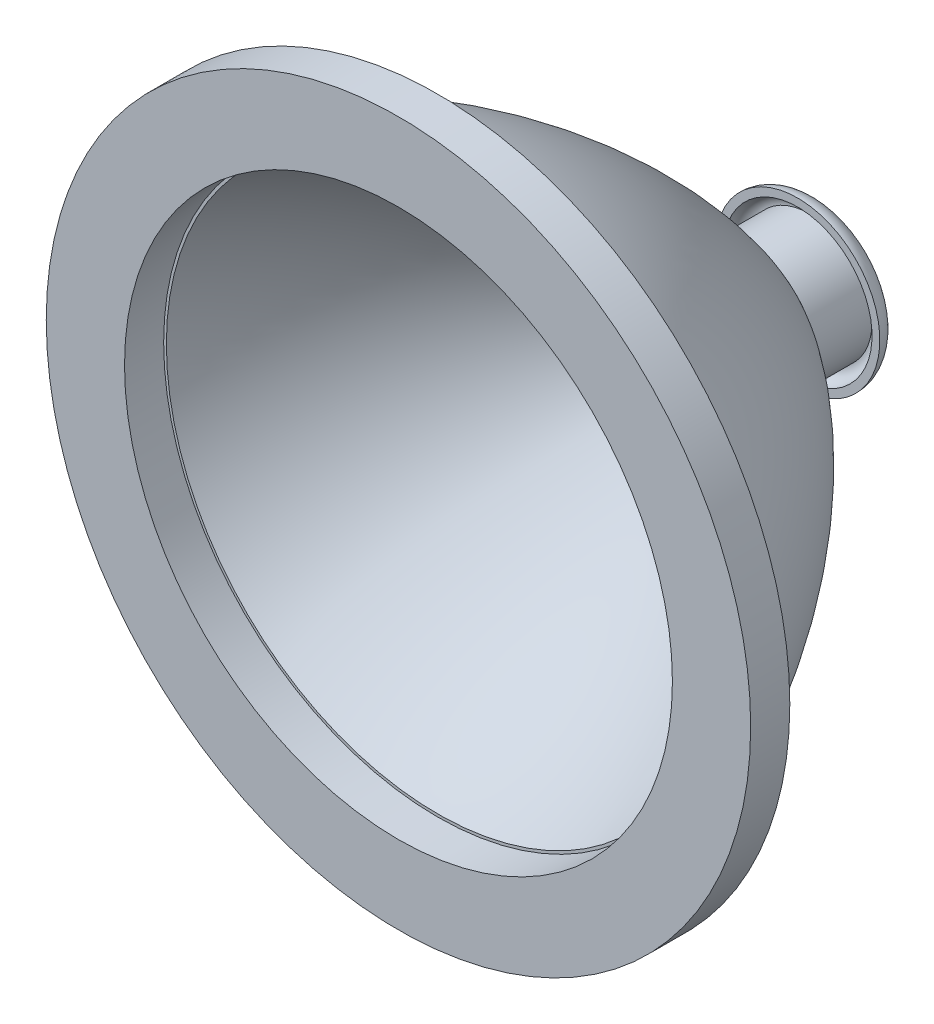
ISO-10303-21;
HEADER;
FILE_DESCRIPTION(('STEP AP214'),'2;1');
FILE_NAME('part.step','',(''),(''),'','','');
FILE_SCHEMA(('AUTOMOTIVE_DESIGN { 1 0 10303 214 1 1 1 1 }'));
ENDSEC;
DATA;
#1=APPLICATION_CONTEXT('core data for automotive mechanical design processes');
#2=APPLICATION_PROTOCOL_DEFINITION('international standard','automotive_design',2000,#1);
#3=PRODUCT_CONTEXT('',#1,'mechanical');
#4=PRODUCT('Part','Part','',(#3));
#5=PRODUCT_RELATED_PRODUCT_CATEGORY('part','',(#4));
#6=PRODUCT_DEFINITION_FORMATION('','',#4);
#7=PRODUCT_DEFINITION_CONTEXT('part definition',#1,'design');
#8=PRODUCT_DEFINITION('design','',#6,#7);
#9=PRODUCT_DEFINITION_SHAPE('','',#8);
#10=(LENGTH_UNIT() NAMED_UNIT(*) SI_UNIT(.MILLI.,.METRE.));
#11=(NAMED_UNIT(*) PLANE_ANGLE_UNIT() SI_UNIT($,.RADIAN.));
#12=(NAMED_UNIT(*) SI_UNIT($,.STERADIAN.) SOLID_ANGLE_UNIT());
#13=UNCERTAINTY_MEASURE_WITH_UNIT(LENGTH_MEASURE(1.E-05),#10,'distance_accuracy_value','');
#14=(GEOMETRIC_REPRESENTATION_CONTEXT(3) GLOBAL_UNCERTAINTY_ASSIGNED_CONTEXT((#13)) GLOBAL_UNIT_ASSIGNED_CONTEXT((#10,
#11,#12)) REPRESENTATION_CONTEXT('',''));
#15=CARTESIAN_POINT('',(0.,0.,0.));
#16=DIRECTION('',(0.,0.,1.));
#17=DIRECTION('',(1.,0.,0.));
#18=AXIS2_PLACEMENT_3D('',#15,#16,#17);
#19=CARTESIAN_POINT('',(0.,0.,0.));
#20=DIRECTION('',(0.,0.,-1.));
#21=DIRECTION('',(-1.,0.,0.));
#22=AXIS2_PLACEMENT_3D('',#19,#20,#21);
#23=PLANE('',#22);
#24=CARTESIAN_POINT('',(0.,0.,0.));
#25=DIRECTION('',(0.,0.,-1.));
#26=DIRECTION('',(-1.,0.,0.));
#27=AXIS2_PLACEMENT_3D('',#24,#25,#26);
#28=CIRCLE('',#27,44.0129431509694);
#29=CARTESIAN_POINT('',(-44.0129431509694,0.,0.));
#30=VERTEX_POINT('',#29);
#31=EDGE_CURVE('E54',#30,#30,#28,.F.);
#32=ORIENTED_EDGE('',*,*,#31,.F.);
#33=EDGE_LOOP('',(#32));
#34=FACE_BOUND('',#33,.T.);
#35=CARTESIAN_POINT('',(0.,0.,0.));
#36=DIRECTION('',(0.,0.,1.));
#37=DIRECTION('',(1.,0.,0.));
#38=AXIS2_PLACEMENT_3D('',#35,#36,#37);
#39=CIRCLE('',#38,44.45);
#40=CARTESIAN_POINT('',(44.45,0.,0.));
#41=VERTEX_POINT('',#40);
#42=EDGE_CURVE('E97',#41,#41,#39,.T.);
#43=ORIENTED_EDGE('',*,*,#42,.T.);
#44=EDGE_LOOP('',(#43));
#45=FACE_BOUND('',#44,.T.);
#46=ADVANCED_FACE('F44',(#34,#45),#23,.F.);
#47=CARTESIAN_POINT('',(0.,0.,-60.96));
#48=DIRECTION('',(0.,0.,1.));
#49=DIRECTION('',(1.,0.,0.));
#50=AXIS2_PLACEMENT_3D('',#47,#48,#49);
#51=CYLINDRICAL_SURFACE('',#50,10.16);
#52=CARTESIAN_POINT('',(0.,0.,-50.8));
#53=DIRECTION('',(0.,0.,-1.));
#54=DIRECTION('',(-1.,0.,0.));
#55=AXIS2_PLACEMENT_3D('',#52,#53,#54);
#56=CIRCLE('',#55,10.16);
#57=CARTESIAN_POINT('',(-10.16,0.,-50.8));
#58=VERTEX_POINT('',#57);
#59=EDGE_CURVE('E63',#58,#58,#56,.T.);
#60=ORIENTED_EDGE('',*,*,#59,.T.);
#61=EDGE_LOOP('',(#60));
#62=FACE_BOUND('',#61,.T.);
#63=CARTESIAN_POINT('',(0.,0.,-60.325));
#64=DIRECTION('',(0.,0.,1.));
#65=DIRECTION('',(1.,0.,0.));
#66=AXIS2_PLACEMENT_3D('',#63,#64,#65);
#67=CIRCLE('',#66,10.16);
#68=CARTESIAN_POINT('',(10.16,0.,-60.325));
#69=VERTEX_POINT('',#68);
#70=EDGE_CURVE('E12',#69,#69,#67,.F.);
#71=ORIENTED_EDGE('',*,*,#70,.F.);
#72=EDGE_LOOP('',(#71));
#73=FACE_BOUND('',#72,.T.);
#74=ADVANCED_FACE('F123',(#62,#73),#51,.T.);
#75=CARTESIAN_POINT('',(0.,0.,34.7283102836008));
#76=DIRECTION('',(0.,0.,1.));
#77=DIRECTION('',(1.,0.,0.));
#78=AXIS2_PLACEMENT_3D('',#75,#76,#77);
#79=DEGENERATE_TOROIDAL_SURFACE('',#78,44.680387854501,101.6,.F.);
#80=CARTESIAN_POINT('',(0.,0.,0.));
#81=DIRECTION('',(0.,0.,1.));
#82=DIRECTION('',(1.,0.,0.));
#83=AXIS2_PLACEMENT_3D('',#80,#81,#82);
#84=CIRCLE('',#83,50.8);
#85=CARTESIAN_POINT('',(50.8,0.,0.));
#86=VERTEX_POINT('',#85);
#87=EDGE_CURVE('E50',#86,#86,#84,.T.);
#88=ORIENTED_EDGE('',*,*,#87,.F.);
#89=EDGE_LOOP('',(#88));
#90=FACE_BOUND('',#89,.T.);
#91=ORIENTED_EDGE('',*,*,#59,.F.);
#92=EDGE_LOOP('',(#91));
#93=FACE_BOUND('',#92,.T.);
#94=ADVANCED_FACE('F128',(#90,#93),#79,.F.);
#95=CARTESIAN_POINT('',(0.,0.,34.7283102836008));
#96=DIRECTION('',(0.,0.,1.));
#97=DIRECTION('',(1.,0.,0.));
#98=AXIS2_PLACEMENT_3D('',#95,#96,#97);
#99=DEGENERATE_TOROIDAL_SURFACE('',#98,44.680387854501,95.25,.F.);
#100=ORIENTED_EDGE('',*,*,#31,.T.);
#101=EDGE_LOOP('',(#100));
#102=FACE_BOUND('',#101,.T.);
#103=CARTESIAN_POINT('',(0.,0.,-44.45));
#104=DIRECTION('',(0.,0.,1.));
#105=DIRECTION('',(1.,0.,0.));
#106=AXIS2_PLACEMENT_3D('',#103,#104,#105);
#107=CIRCLE('',#106,8.26635596071234);
#108=CARTESIAN_POINT('',(8.26635596071234,0.,-44.45));
#109=VERTEX_POINT('',#108);
#110=EDGE_CURVE('E58',#109,#109,#107,.T.);
#111=ORIENTED_EDGE('',*,*,#110,.F.);
#112=EDGE_LOOP('',(#111));
#113=FACE_BOUND('',#112,.T.);
#114=ADVANCED_FACE('F251',(#102,#113),#99,.T.);
#115=CARTESIAN_POINT('',(0.,0.,-44.45));
#116=DIRECTION('',(0.,0.,1.));
#117=DIRECTION('',(1.,0.,0.));
#118=AXIS2_PLACEMENT_3D('',#115,#116,#117);
#119=PLANE('',#118);
#120=CARTESIAN_POINT('',(0.,0.,-44.45));
#121=DIRECTION('',(0.,0.,1.));
#122=DIRECTION('',(1.,0.,0.));
#123=AXIS2_PLACEMENT_3D('',#120,#121,#122);
#124=CIRCLE('',#123,7.62);
#125=CARTESIAN_POINT('',(7.62,0.,-44.45));
#126=VERTEX_POINT('',#125);
#127=EDGE_CURVE('E75',#126,#126,#124,.T.);
#128=ORIENTED_EDGE('',*,*,#127,.F.);
#129=EDGE_LOOP('',(#128));
#130=FACE_BOUND('',#129,.T.);
#131=ORIENTED_EDGE('',*,*,#110,.T.);
#132=EDGE_LOOP('',(#131));
#133=FACE_BOUND('',#132,.T.);
#134=ADVANCED_FACE('F241',(#130,#133),#119,.T.);
#135=CARTESIAN_POINT('',(0.,0.,-60.96));
#136=DIRECTION('',(0.,0.,-1.));
#137=DIRECTION('',(-1.,0.,0.));
#138=AXIS2_PLACEMENT_3D('',#135,#136,#137);
#139=PLANE('',#138);
#140=CARTESIAN_POINT('',(0.,0.,-60.96));
#141=DIRECTION('',(0.,0.,1.));
#142=DIRECTION('',(1.,0.,0.));
#143=AXIS2_PLACEMENT_3D('',#140,#141,#142);
#144=CIRCLE('',#143,6.54812);
#145=CARTESIAN_POINT('',(6.54812,0.,-60.96));
#146=VERTEX_POINT('',#145);
#147=EDGE_CURVE('E66',#146,#146,#144,.T.);
#148=ORIENTED_EDGE('',*,*,#147,.T.);
#149=EDGE_LOOP('',(#148));
#150=FACE_BOUND('',#149,.T.);
#151=CARTESIAN_POINT('',(0.,0.,-60.96));
#152=DIRECTION('',(0.,0.,-1.));
#153=DIRECTION('',(-1.,0.,0.));
#154=AXIS2_PLACEMENT_3D('',#151,#152,#153);
#155=CIRCLE('',#154,10.16);
#156=CARTESIAN_POINT('',(-10.16,0.,-60.96));
#157=VERTEX_POINT('',#156);
#158=EDGE_CURVE('E78',#157,#157,#155,.T.);
#159=ORIENTED_EDGE('',*,*,#158,.T.);
#160=EDGE_LOOP('',(#159));
#161=FACE_BOUND('',#160,.T.);
#162=ADVANCED_FACE('F231',(#150,#161),#139,.T.);
#163=CARTESIAN_POINT('',(0.,0.,-44.45));
#164=DIRECTION('',(0.,0.,1.));
#165=DIRECTION('',(1.,0.,0.));
#166=AXIS2_PLACEMENT_3D('',#163,#164,#165);
#167=CYLINDRICAL_SURFACE('',#166,6.54812);
#168=ORIENTED_EDGE('',*,*,#147,.F.);
#169=EDGE_LOOP('',(#168));
#170=FACE_BOUND('',#169,.T.);
#171=CARTESIAN_POINT('',(0.,0.,-49.53));
#172=DIRECTION('',(0.,0.,1.));
#173=DIRECTION('',(1.,0.,0.));
#174=AXIS2_PLACEMENT_3D('',#171,#172,#173);
#175=CIRCLE('',#174,6.54812);
#176=CARTESIAN_POINT('',(6.54812,0.,-49.53));
#177=VERTEX_POINT('',#176);
#178=EDGE_CURVE('E69',#177,#177,#175,.T.);
#179=ORIENTED_EDGE('',*,*,#178,.T.);
#180=EDGE_LOOP('',(#179));
#181=FACE_BOUND('',#180,.T.);
#182=ADVANCED_FACE('F221',(#170,#181),#167,.F.);
#183=CARTESIAN_POINT('',(6.54812,0.,-49.53));
#184=DIRECTION('',(0.,0.,-1.));
#185=DIRECTION('',(-1.,0.,0.));
#186=AXIS2_PLACEMENT_3D('',#183,#184,#185);
#187=PLANE('',#186);
#188=ORIENTED_EDGE('',*,*,#178,.F.);
#189=EDGE_LOOP('',(#188));
#190=FACE_BOUND('',#189,.T.);
#191=CARTESIAN_POINT('',(0.,0.,-49.53));
#192=DIRECTION('',(0.,0.,1.));
#193=DIRECTION('',(1.,0.,0.));
#194=AXIS2_PLACEMENT_3D('',#191,#192,#193);
#195=CIRCLE('',#194,7.62);
#196=CARTESIAN_POINT('',(7.62,0.,-49.53));
#197=VERTEX_POINT('',#196);
#198=EDGE_CURVE('E72',#197,#197,#195,.T.);
#199=ORIENTED_EDGE('',*,*,#198,.T.);
#200=EDGE_LOOP('',(#199));
#201=FACE_BOUND('',#200,.T.);
#202=ADVANCED_FACE('F211',(#190,#201),#187,.F.);
#203=CARTESIAN_POINT('',(0.,0.,-44.45));
#204=DIRECTION('',(0.,0.,1.));
#205=DIRECTION('',(1.,0.,0.));
#206=AXIS2_PLACEMENT_3D('',#203,#204,#205);
#207=CYLINDRICAL_SURFACE('',#206,7.62);
#208=ORIENTED_EDGE('',*,*,#198,.F.);
#209=EDGE_LOOP('',(#208));
#210=FACE_BOUND('',#209,.T.);
#211=ORIENTED_EDGE('',*,*,#127,.T.);
#212=EDGE_LOOP('',(#211));
#213=FACE_BOUND('',#212,.T.);
#214=ADVANCED_FACE('F194',(#210,#213),#207,.F.);
#215=CARTESIAN_POINT('',(0.,0.,-58.42));
#216=DIRECTION('',(0.,0.,-1.));
#217=DIRECTION('',(-1.,0.,0.));
#218=AXIS2_PLACEMENT_3D('',#215,#216,#217);
#219=TOROIDAL_SURFACE('',#218,10.16,3.175);
#220=CARTESIAN_POINT('',(0.,0.,-58.42));
#221=DIRECTION('',(0.,0.,-1.));
#222=DIRECTION('',(-1.,0.,0.));
#223=AXIS2_PLACEMENT_3D('',#220,#221,#222);
#224=CIRCLE('',#223,13.335);
#225=CARTESIAN_POINT('',(-13.335,0.,-58.42));
#226=VERTEX_POINT('',#225);
#227=EDGE_CURVE('E81',#226,#226,#224,.T.);
#228=ORIENTED_EDGE('',*,*,#227,.T.);
#229=EDGE_LOOP('',(#228));
#230=FACE_BOUND('',#229,.T.);
#231=CARTESIAN_POINT('',(0.,0.,-61.595));
#232=DIRECTION('',(0.,0.,-1.));
#233=DIRECTION('',(-1.,0.,0.));
#234=AXIS2_PLACEMENT_3D('',#231,#232,#233);
#235=CIRCLE('',#234,10.16);
#236=CARTESIAN_POINT('',(-10.16,0.,-61.595));
#237=VERTEX_POINT('',#236);
#238=EDGE_CURVE('E87',#237,#237,#235,.T.);
#239=ORIENTED_EDGE('',*,*,#238,.F.);
#240=EDGE_LOOP('',(#239));
#241=FACE_BOUND('',#240,.T.);
#242=ADVANCED_FACE('F184',(#230,#241),#219,.T.);
#243=CARTESIAN_POINT('',(0.,12.065,-58.42));
#244=DIRECTION('',(0.,0.,-1.));
#245=DIRECTION('',(-1.,0.,0.));
#246=AXIS2_PLACEMENT_3D('',#243,#244,#245);
#247=PLANE('',#246);
#248=ORIENTED_EDGE('',*,*,#227,.F.);
#249=EDGE_LOOP('',(#248));
#250=FACE_BOUND('',#249,.T.);
#251=CARTESIAN_POINT('',(0.,0.,-58.42));
#252=DIRECTION('',(0.,0.,-1.));
#253=DIRECTION('',(-1.,0.,0.));
#254=AXIS2_PLACEMENT_3D('',#251,#252,#253);
#255=CIRCLE('',#254,12.065);
#256=CARTESIAN_POINT('',(-12.065,0.,-58.42));
#257=VERTEX_POINT('',#256);
#258=EDGE_CURVE('E84',#257,#257,#255,.T.);
#259=ORIENTED_EDGE('',*,*,#258,.T.);
#260=EDGE_LOOP('',(#259));
#261=FACE_BOUND('',#260,.T.);
#262=ADVANCED_FACE('F174',(#250,#261),#247,.F.);
#263=CARTESIAN_POINT('',(0.,0.,-58.42));
#264=DIRECTION('',(0.,0.,-1.));
#265=DIRECTION('',(-1.,0.,0.));
#266=AXIS2_PLACEMENT_3D('',#263,#264,#265);
#267=TOROIDAL_SURFACE('',#266,10.16,1.905);
#268=ORIENTED_EDGE('',*,*,#258,.F.);
#269=EDGE_LOOP('',(#268));
#270=FACE_BOUND('',#269,.T.);
#271=ORIENTED_EDGE('',*,*,#70,.T.);
#272=EDGE_LOOP('',(#271));
#273=FACE_BOUND('',#272,.T.);
#274=ADVANCED_FACE('F164',(#270,#273),#267,.F.);
#275=CARTESIAN_POINT('',(0.,0.,-60.96));
#276=DIRECTION('',(0.,0.,-1.));
#277=DIRECTION('',(-1.,0.,0.));
#278=AXIS2_PLACEMENT_3D('',#275,#276,#277);
#279=CYLINDRICAL_SURFACE('',#278,10.16);
#280=ORIENTED_EDGE('',*,*,#158,.F.);
#281=EDGE_LOOP('',(#280));
#282=FACE_BOUND('',#281,.T.);
#283=ORIENTED_EDGE('',*,*,#238,.T.);
#284=EDGE_LOOP('',(#283));
#285=FACE_BOUND('',#284,.T.);
#286=ADVANCED_FACE('F118',(#282,#285),#279,.F.);
#287=CARTESIAN_POINT('',(0.,0.,0.));
#288=DIRECTION('',(0.,0.,1.));
#289=DIRECTION('',(1.,0.,0.));
#290=AXIS2_PLACEMENT_3D('',#287,#288,#289);
#291=PLANE('',#290);
#292=CARTESIAN_POINT('',(0.,0.,0.));
#293=DIRECTION('',(0.,0.,1.));
#294=DIRECTION('',(1.,0.,0.));
#295=AXIS2_PLACEMENT_3D('',#292,#293,#294);
#296=CIRCLE('',#295,57.15);
#297=CARTESIAN_POINT('',(57.15,0.,0.));
#298=VERTEX_POINT('',#297);
#299=EDGE_CURVE('E91',#298,#298,#296,.T.);
#300=ORIENTED_EDGE('',*,*,#299,.F.);
#301=EDGE_LOOP('',(#300));
#302=FACE_BOUND('',#301,.T.);
#303=ORIENTED_EDGE('',*,*,#87,.T.);
#304=EDGE_LOOP('',(#303));
#305=FACE_BOUND('',#304,.T.);
#306=ADVANCED_FACE('F109',(#302,#305),#291,.F.);
#307=CARTESIAN_POINT('',(0.,0.,6.35));
#308=DIRECTION('',(0.,0.,1.));
#309=DIRECTION('',(1.,0.,0.));
#310=AXIS2_PLACEMENT_3D('',#307,#308,#309);
#311=PLANE('',#310);
#312=CARTESIAN_POINT('',(0.,0.,6.35));
#313=DIRECTION('',(0.,0.,1.));
#314=DIRECTION('',(1.,0.,0.));
#315=AXIS2_PLACEMENT_3D('',#312,#313,#314);
#316=CIRCLE('',#315,57.15);
#317=CARTESIAN_POINT('',(57.15,0.,6.35));
#318=VERTEX_POINT('',#317);
#319=EDGE_CURVE('E90',#318,#318,#316,.T.);
#320=ORIENTED_EDGE('',*,*,#319,.T.);
#321=EDGE_LOOP('',(#320));
#322=FACE_BOUND('',#321,.T.);
#323=CARTESIAN_POINT('',(0.,0.,6.35));
#324=DIRECTION('',(0.,0.,1.));
#325=DIRECTION('',(1.,0.,0.));
#326=AXIS2_PLACEMENT_3D('',#323,#324,#325);
#327=CIRCLE('',#326,44.45);
#328=CARTESIAN_POINT('',(44.45,0.,6.35));
#329=VERTEX_POINT('',#328);
#330=EDGE_CURVE('E94',#329,#329,#327,.T.);
#331=ORIENTED_EDGE('',*,*,#330,.F.);
#332=EDGE_LOOP('',(#331));
#333=FACE_BOUND('',#332,.T.);
#334=ADVANCED_FACE('F106',(#322,#333),#311,.T.);
#335=CARTESIAN_POINT('',(0.,0.,6.35));
#336=DIRECTION('',(0.,0.,-1.));
#337=DIRECTION('',(-1.,0.,0.));
#338=AXIS2_PLACEMENT_3D('',#335,#336,#337);
#339=CYLINDRICAL_SURFACE('',#338,57.15);
#340=ORIENTED_EDGE('',*,*,#319,.F.);
#341=EDGE_LOOP('',(#340));
#342=FACE_BOUND('',#341,.T.);
#343=ORIENTED_EDGE('',*,*,#299,.T.);
#344=EDGE_LOOP('',(#343));
#345=FACE_BOUND('',#344,.T.);
#346=ADVANCED_FACE('F108',(#342,#345),#339,.T.);
#347=CARTESIAN_POINT('',(0.,0.,6.35));
#348=DIRECTION('',(0.,0.,-1.));
#349=DIRECTION('',(-1.,0.,0.));
#350=AXIS2_PLACEMENT_3D('',#347,#348,#349);
#351=CYLINDRICAL_SURFACE('',#350,44.45);
#352=ORIENTED_EDGE('',*,*,#330,.T.);
#353=EDGE_LOOP('',(#352));
#354=FACE_BOUND('',#353,.T.);
#355=ORIENTED_EDGE('',*,*,#42,.F.);
#356=EDGE_LOOP('',(#355));
#357=FACE_BOUND('',#356,.T.);
#358=ADVANCED_FACE('F103',(#354,#357),#351,.F.);
#359=CLOSED_SHELL('',(#46,#74,#94,#114,#134,#162,#182,#202,#214,#242,#262,#274,#286,#306,#334,
#346,#358));
#360=MANIFOLD_SOLID_BREP('B2',#359);
#361=ADVANCED_BREP_SHAPE_REPRESENTATION('',(#18,#360),#14);
#362=SHAPE_DEFINITION_REPRESENTATION(#9,#361);
ENDSEC;
END-ISO-10303-21;
